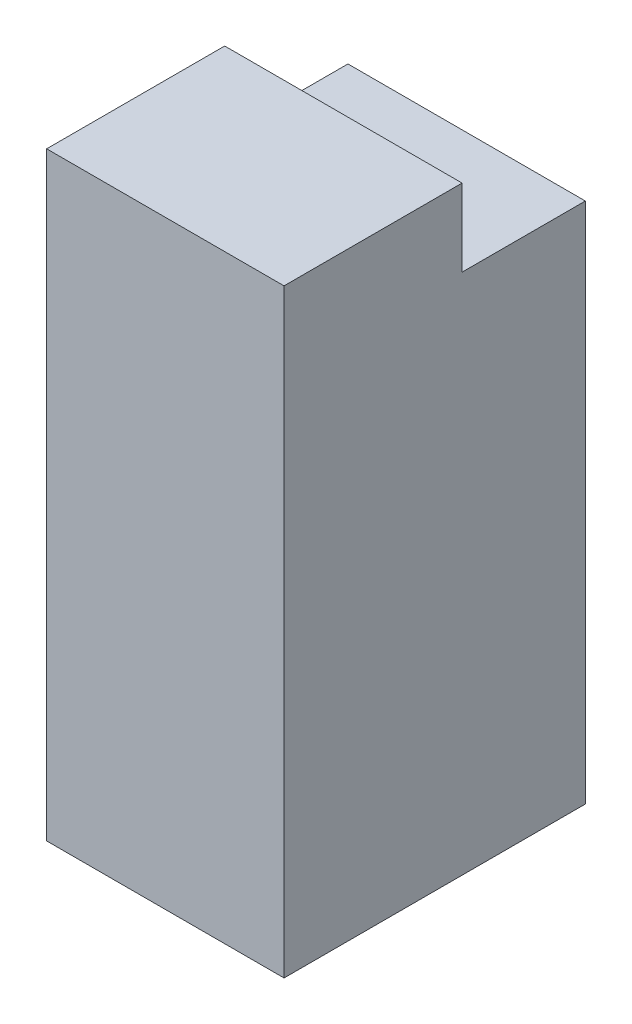
ISO-10303-21;
HEADER;
FILE_DESCRIPTION(('STEP AP214'),'2;1');
FILE_NAME('part.step','',(''),(''),'','','');
FILE_SCHEMA(('AUTOMOTIVE_DESIGN { 1 0 10303 214 1 1 1 1 }'));
ENDSEC;
DATA;
#1=APPLICATION_CONTEXT('core data for automotive mechanical design processes');
#2=APPLICATION_PROTOCOL_DEFINITION('international standard','automotive_design',2000,#1);
#3=PRODUCT_CONTEXT('',#1,'mechanical');
#4=PRODUCT('Part','Part','',(#3));
#5=PRODUCT_RELATED_PRODUCT_CATEGORY('part','',(#4));
#6=PRODUCT_DEFINITION_FORMATION('','',#4);
#7=PRODUCT_DEFINITION_CONTEXT('part definition',#1,'design');
#8=PRODUCT_DEFINITION('design','',#6,#7);
#9=PRODUCT_DEFINITION_SHAPE('','',#8);
#10=(LENGTH_UNIT() NAMED_UNIT(*) SI_UNIT(.MILLI.,.METRE.));
#11=(NAMED_UNIT(*) PLANE_ANGLE_UNIT() SI_UNIT($,.RADIAN.));
#12=(NAMED_UNIT(*) SI_UNIT($,.STERADIAN.) SOLID_ANGLE_UNIT());
#13=UNCERTAINTY_MEASURE_WITH_UNIT(LENGTH_MEASURE(1.E-05),#10,'distance_accuracy_value','');
#14=(GEOMETRIC_REPRESENTATION_CONTEXT(3) GLOBAL_UNCERTAINTY_ASSIGNED_CONTEXT((#13)) GLOBAL_UNIT_ASSIGNED_CONTEXT((#10,
#11,#12)) REPRESENTATION_CONTEXT('',''));
#15=CARTESIAN_POINT('',(0.,0.,0.));
#16=DIRECTION('',(0.,0.,1.));
#17=DIRECTION('',(1.,0.,0.));
#18=AXIS2_PLACEMENT_3D('',#15,#16,#17);
#19=CARTESIAN_POINT('',(-400.,-5300.,300.));
#20=DIRECTION('',(1.,0.,0.));
#21=DIRECTION('',(0.,0.,-1.));
#22=AXIS2_PLACEMENT_3D('',#19,#20,#21);
#23=PLANE('',#22);
#24=DIRECTION('',(0.,0.,-1.));
#25=VECTOR('',#24,1.);
#26=CARTESIAN_POINT('',(-400.,-4290.,300.));
#27=LINE('',#26,#25);
#28=CARTESIAN_POINT('',(-400.,-4290.,300.));
#29=VERTEX_POINT('',#28);
#30=CARTESIAN_POINT('',(-400.,-4290.,0.));
#31=VERTEX_POINT('',#30);
#32=EDGE_CURVE('E107',#29,#31,#27,.T.);
#33=ORIENTED_EDGE('',*,*,#32,.T.);
#34=DIRECTION('',(0.,1.,0.));
#35=VECTOR('',#34,1.);
#36=CARTESIAN_POINT('',(-400.,-5300.,0.));
#37=LINE('',#36,#35);
#38=CARTESIAN_POINT('',(-400.,-4420.,0.));
#39=VERTEX_POINT('',#38);
#40=EDGE_CURVE('E12',#39,#31,#37,.T.);
#41=ORIENTED_EDGE('',*,*,#40,.F.);
#42=DIRECTION('',(0.,0.,1.));
#43=VECTOR('',#42,1.);
#44=CARTESIAN_POINT('',(-400.,-4420.,-207.664317165683));
#45=LINE('',#44,#43);
#46=CARTESIAN_POINT('',(-400.,-4420.,-207.664317165683));
#47=VERTEX_POINT('',#46);
#48=EDGE_CURVE('E64',#47,#39,#45,.T.);
#49=ORIENTED_EDGE('',*,*,#48,.F.);
#50=DIRECTION('',(0.,1.,0.));
#51=VECTOR('',#50,1.);
#52=CARTESIAN_POINT('',(-400.,-5300.,-207.664317165683));
#53=LINE('',#52,#51);
#54=CARTESIAN_POINT('',(-400.,-5300.,-207.664317165683));
#55=VERTEX_POINT('',#54);
#56=EDGE_CURVE('E141',#55,#47,#53,.T.);
#57=ORIENTED_EDGE('',*,*,#56,.F.);
#58=DIRECTION('',(0.,0.,-1.));
#59=VECTOR('',#58,1.);
#60=CARTESIAN_POINT('',(-400.,-5300.,300.));
#61=LINE('',#60,#59);
#62=CARTESIAN_POINT('',(-400.,-5300.,300.));
#63=VERTEX_POINT('',#62);
#64=EDGE_CURVE('E101',#63,#55,#61,.T.);
#65=ORIENTED_EDGE('',*,*,#64,.F.);
#66=DIRECTION('',(0.,1.,0.));
#67=VECTOR('',#66,1.);
#68=CARTESIAN_POINT('',(-400.,-5300.,300.));
#69=LINE('',#68,#67);
#70=EDGE_CURVE('E94',#63,#29,#69,.T.);
#71=ORIENTED_EDGE('',*,*,#70,.T.);
#72=EDGE_LOOP('',(#33,#41,#49,#57,#65,#71));
#73=FACE_BOUND('',#72,.T.);
#74=ADVANCED_FACE('F45',(#73),#23,.F.);
#75=CARTESIAN_POINT('',(-400.,-5300.,0.));
#76=DIRECTION('',(0.,0.,1.));
#77=DIRECTION('',(1.,0.,0.));
#78=AXIS2_PLACEMENT_3D('',#75,#76,#77);
#79=PLANE('',#78);
#80=DIRECTION('',(0.,1.,0.));
#81=VECTOR('',#80,1.);
#82=CARTESIAN_POINT('',(0.,-5300.,0.));
#83=LINE('',#82,#81);
#84=CARTESIAN_POINT('',(0.,-4420.,0.));
#85=VERTEX_POINT('',#84);
#86=CARTESIAN_POINT('',(0.,-4290.,0.));
#87=VERTEX_POINT('',#86);
#88=EDGE_CURVE('E56',#85,#87,#83,.T.);
#89=ORIENTED_EDGE('',*,*,#88,.F.);
#90=DIRECTION('',(1.,0.,0.));
#91=VECTOR('',#90,1.);
#92=CARTESIAN_POINT('',(0.,-4420.,0.));
#93=LINE('',#92,#91);
#94=EDGE_CURVE('E114',#39,#85,#93,.T.);
#95=ORIENTED_EDGE('',*,*,#94,.F.);
#96=ORIENTED_EDGE('',*,*,#40,.T.);
#97=DIRECTION('',(1.,0.,0.));
#98=VECTOR('',#97,1.);
#99=CARTESIAN_POINT('',(-400.,-4290.,0.));
#100=LINE('',#99,#98);
#101=EDGE_CURVE('E113',#31,#87,#100,.T.);
#102=ORIENTED_EDGE('',*,*,#101,.T.);
#103=EDGE_LOOP('',(#89,#95,#96,#102));
#104=FACE_BOUND('',#103,.T.);
#105=ADVANCED_FACE('F180',(#104),#79,.F.);
#106=CARTESIAN_POINT('',(0.,-5300.,300.));
#107=DIRECTION('',(-1.,0.,0.));
#108=DIRECTION('',(0.,0.,1.));
#109=AXIS2_PLACEMENT_3D('',#106,#107,#108);
#110=PLANE('',#109);
#111=DIRECTION('',(0.,0.,1.));
#112=VECTOR('',#111,1.);
#113=CARTESIAN_POINT('',(0.,-4290.,300.));
#114=LINE('',#113,#112);
#115=CARTESIAN_POINT('',(0.,-4290.,300.));
#116=VERTEX_POINT('',#115);
#117=EDGE_CURVE('E102',#87,#116,#114,.T.);
#118=ORIENTED_EDGE('',*,*,#117,.T.);
#119=DIRECTION('',(0.,1.,0.));
#120=VECTOR('',#119,1.);
#121=CARTESIAN_POINT('',(0.,-5300.,300.));
#122=LINE('',#121,#120);
#123=CARTESIAN_POINT('',(0.,-5300.,300.));
#124=VERTEX_POINT('',#123);
#125=EDGE_CURVE('E97',#124,#116,#122,.T.);
#126=ORIENTED_EDGE('',*,*,#125,.F.);
#127=DIRECTION('',(0.,0.,1.));
#128=VECTOR('',#127,1.);
#129=CARTESIAN_POINT('',(0.,-5300.,300.));
#130=LINE('',#129,#128);
#131=CARTESIAN_POINT('',(0.,-5300.,-207.664317165683));
#132=VERTEX_POINT('',#131);
#133=EDGE_CURVE('E129',#132,#124,#130,.T.);
#134=ORIENTED_EDGE('',*,*,#133,.F.);
#135=DIRECTION('',(0.,-1.,0.));
#136=VECTOR('',#135,1.);
#137=CARTESIAN_POINT('',(0.,-5300.,-207.664317165683));
#138=LINE('',#137,#136);
#139=CARTESIAN_POINT('',(0.,-4420.,-207.664317165683));
#140=VERTEX_POINT('',#139);
#141=EDGE_CURVE('E192',#140,#132,#138,.T.);
#142=ORIENTED_EDGE('',*,*,#141,.F.);
#143=DIRECTION('',(0.,0.,1.));
#144=VECTOR('',#143,1.);
#145=CARTESIAN_POINT('',(0.,-4420.,-207.664317165683));
#146=LINE('',#145,#144);
#147=EDGE_CURVE('E117',#140,#85,#146,.T.);
#148=ORIENTED_EDGE('',*,*,#147,.T.);
#149=ORIENTED_EDGE('',*,*,#88,.T.);
#150=EDGE_LOOP('',(#118,#126,#134,#142,#148,#149));
#151=FACE_BOUND('',#150,.T.);
#152=ADVANCED_FACE('F177',(#151),#110,.F.);
#153=CARTESIAN_POINT('',(-400.,-5300.,300.));
#154=DIRECTION('',(0.,0.,-1.));
#155=DIRECTION('',(-1.,0.,0.));
#156=AXIS2_PLACEMENT_3D('',#153,#154,#155);
#157=PLANE('',#156);
#158=DIRECTION('',(-1.,0.,0.));
#159=VECTOR('',#158,1.);
#160=CARTESIAN_POINT('',(-400.,-4290.,300.));
#161=LINE('',#160,#159);
#162=EDGE_CURVE('E91',#116,#29,#161,.T.);
#163=ORIENTED_EDGE('',*,*,#162,.T.);
#164=ORIENTED_EDGE('',*,*,#70,.F.);
#165=DIRECTION('',(-1.,0.,0.));
#166=VECTOR('',#165,1.);
#167=CARTESIAN_POINT('',(-400.,-5300.,300.));
#168=LINE('',#167,#166);
#169=EDGE_CURVE('E73',#124,#63,#168,.T.);
#170=ORIENTED_EDGE('',*,*,#169,.F.);
#171=ORIENTED_EDGE('',*,*,#125,.T.);
#172=EDGE_LOOP('',(#163,#164,#170,#171));
#173=FACE_BOUND('',#172,.T.);
#174=ADVANCED_FACE('F93',(#173),#157,.F.);
#175=CARTESIAN_POINT('',(0.,-5300.,0.));
#176=DIRECTION('',(0.,-1.,0.));
#177=DIRECTION('',(0.,0.,-1.));
#178=AXIS2_PLACEMENT_3D('',#175,#176,#177);
#179=PLANE('',#178);
#180=ORIENTED_EDGE('',*,*,#64,.T.);
#181=DIRECTION('',(-1.,0.,0.));
#182=VECTOR('',#181,1.);
#183=CARTESIAN_POINT('',(-400.,-5300.,-207.664317165683));
#184=LINE('',#183,#182);
#185=EDGE_CURVE('E154',#132,#55,#184,.T.);
#186=ORIENTED_EDGE('',*,*,#185,.F.);
#187=ORIENTED_EDGE('',*,*,#133,.T.);
#188=ORIENTED_EDGE('',*,*,#169,.T.);
#189=EDGE_LOOP('',(#180,#186,#187,#188));
#190=FACE_BOUND('',#189,.T.);
#191=ADVANCED_FACE('F160',(#190),#179,.T.);
#192=CARTESIAN_POINT('',(0.,-4290.,0.));
#193=DIRECTION('',(0.,-1.,0.));
#194=DIRECTION('',(0.,0.,-1.));
#195=AXIS2_PLACEMENT_3D('',#192,#193,#194);
#196=PLANE('',#195);
#197=ORIENTED_EDGE('',*,*,#32,.F.);
#198=ORIENTED_EDGE('',*,*,#162,.F.);
#199=ORIENTED_EDGE('',*,*,#117,.F.);
#200=ORIENTED_EDGE('',*,*,#101,.F.);
#201=EDGE_LOOP('',(#197,#198,#199,#200));
#202=FACE_BOUND('',#201,.T.);
#203=ADVANCED_FACE('F111',(#202),#196,.F.);
#204=CARTESIAN_POINT('',(0.,0.,-207.664317165683));
#205=DIRECTION('',(0.,0.,-1.));
#206=DIRECTION('',(-1.,0.,0.));
#207=AXIS2_PLACEMENT_3D('',#204,#205,#206);
#208=PLANE('',#207);
#209=ORIENTED_EDGE('',*,*,#56,.T.);
#210=DIRECTION('',(1.,0.,0.));
#211=VECTOR('',#210,1.);
#212=CARTESIAN_POINT('',(-400.,-4420.,-207.664317165683));
#213=LINE('',#212,#211);
#214=EDGE_CURVE('E201',#47,#140,#213,.T.);
#215=ORIENTED_EDGE('',*,*,#214,.T.);
#216=ORIENTED_EDGE('',*,*,#141,.T.);
#217=ORIENTED_EDGE('',*,*,#185,.T.);
#218=EDGE_LOOP('',(#209,#215,#216,#217));
#219=FACE_BOUND('',#218,.T.);
#220=ADVANCED_FACE('F175',(#219),#208,.T.);
#221=CARTESIAN_POINT('',(0.,-4420.,0.));
#222=DIRECTION('',(0.,1.,0.));
#223=DIRECTION('',(0.,0.,1.));
#224=AXIS2_PLACEMENT_3D('',#221,#222,#223);
#225=PLANE('',#224);
#226=ORIENTED_EDGE('',*,*,#48,.T.);
#227=ORIENTED_EDGE('',*,*,#94,.T.);
#228=ORIENTED_EDGE('',*,*,#147,.F.);
#229=ORIENTED_EDGE('',*,*,#214,.F.);
#230=EDGE_LOOP('',(#226,#227,#228,#229));
#231=FACE_BOUND('',#230,.T.);
#232=ADVANCED_FACE('F170',(#231),#225,.T.);
#233=CLOSED_SHELL('',(#74,#105,#152,#174,#191,#203,#220,#232));
#234=MANIFOLD_SOLID_BREP('B2',#233);
#235=ADVANCED_BREP_SHAPE_REPRESENTATION('',(#18,#234),#14);
#236=SHAPE_DEFINITION_REPRESENTATION(#9,#235);
ENDSEC;
END-ISO-10303-21;
